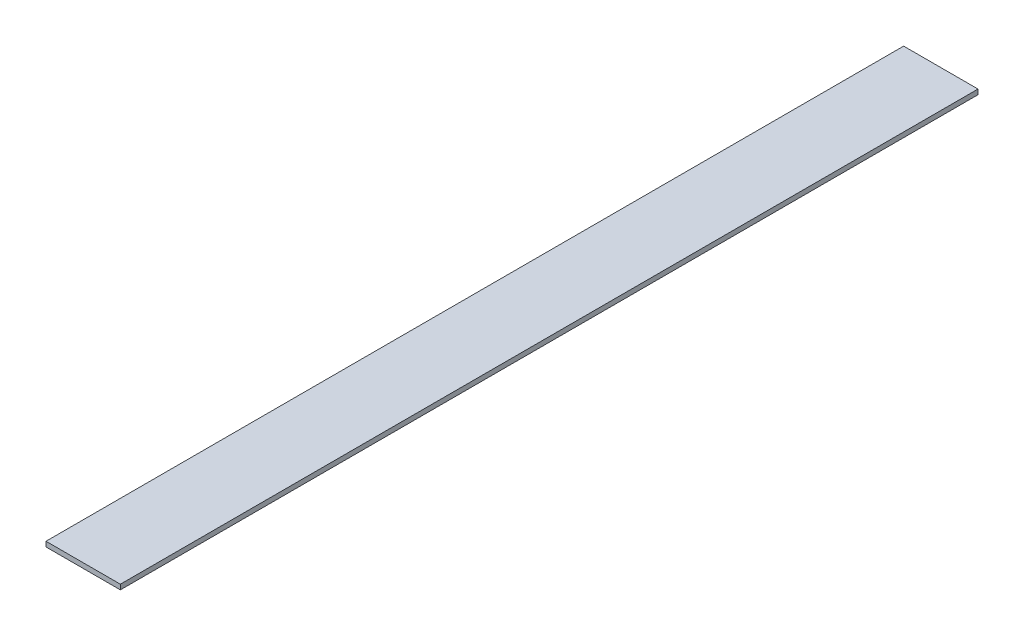
ISO-10303-21;
HEADER;
FILE_DESCRIPTION(('STEP AP214'),'2;1');
FILE_NAME('part.step','',(''),(''),'','','');
FILE_SCHEMA(('AUTOMOTIVE_DESIGN { 1 0 10303 214 1 1 1 1 }'));
ENDSEC;
DATA;
#1=APPLICATION_CONTEXT('core data for automotive mechanical design processes');
#2=APPLICATION_PROTOCOL_DEFINITION('international standard','automotive_design',2000,#1);
#3=PRODUCT_CONTEXT('',#1,'mechanical');
#4=PRODUCT('Part','Part','',(#3));
#5=PRODUCT_RELATED_PRODUCT_CATEGORY('part','',(#4));
#6=PRODUCT_DEFINITION_FORMATION('','',#4);
#7=PRODUCT_DEFINITION_CONTEXT('part definition',#1,'design');
#8=PRODUCT_DEFINITION('design','',#6,#7);
#9=PRODUCT_DEFINITION_SHAPE('','',#8);
#10=(LENGTH_UNIT() NAMED_UNIT(*) SI_UNIT(.MILLI.,.METRE.));
#11=(NAMED_UNIT(*) PLANE_ANGLE_UNIT() SI_UNIT($,.RADIAN.));
#12=(NAMED_UNIT(*) SI_UNIT($,.STERADIAN.) SOLID_ANGLE_UNIT());
#13=UNCERTAINTY_MEASURE_WITH_UNIT(LENGTH_MEASURE(1.E-05),#10,'distance_accuracy_value','');
#14=(GEOMETRIC_REPRESENTATION_CONTEXT(3) GLOBAL_UNCERTAINTY_ASSIGNED_CONTEXT((#13)) GLOBAL_UNIT_ASSIGNED_CONTEXT((#10,
#11,#12)) REPRESENTATION_CONTEXT('',''));
#15=CARTESIAN_POINT('',(0.,0.,0.));
#16=DIRECTION('',(0.,0.,1.));
#17=DIRECTION('',(1.,0.,0.));
#18=AXIS2_PLACEMENT_3D('',#15,#16,#17);
#19=CARTESIAN_POINT('',(15.,-0.999999999999997,-176.066592756746));
#20=DIRECTION('',(0.,-1.,0.));
#21=DIRECTION('',(1.,0.,0.));
#22=AXIS2_PLACEMENT_3D('',#19,#20,#21);
#23=PLANE('',#22);
#24=DIRECTION('',(0.,0.,1.));
#25=VECTOR('',#24,1.);
#26=CARTESIAN_POINT('',(-15.,-1.,-176.066592756746));
#27=LINE('',#26,#25);
#28=CARTESIAN_POINT('',(-15.,-1.,-146.));
#29=VERTEX_POINT('',#28);
#30=CARTESIAN_POINT('',(-15.,-1.,200.));
#31=VERTEX_POINT('',#30);
#32=EDGE_CURVE('E74',#29,#31,#27,.T.);
#33=ORIENTED_EDGE('',*,*,#32,.F.);
#34=DIRECTION('',(1.,0.,0.));
#35=VECTOR('',#34,1.);
#36=CARTESIAN_POINT('',(15.,-0.999999999999997,-146.));
#37=LINE('',#36,#35);
#38=CARTESIAN_POINT('',(15.,-0.999999999999997,-146.));
#39=VERTEX_POINT('',#38);
#40=EDGE_CURVE('E55',#29,#39,#37,.T.);
#41=ORIENTED_EDGE('',*,*,#40,.T.);
#42=DIRECTION('',(0.,0.,1.));
#43=VECTOR('',#42,1.);
#44=CARTESIAN_POINT('',(15.,-0.999999999999997,-176.066592756746));
#45=LINE('',#44,#43);
#46=CARTESIAN_POINT('',(15.,-0.999999999999997,200.));
#47=VERTEX_POINT('',#46);
#48=EDGE_CURVE('E79',#39,#47,#45,.T.);
#49=ORIENTED_EDGE('',*,*,#48,.T.);
#50=DIRECTION('',(1.,0.,0.));
#51=VECTOR('',#50,1.);
#52=CARTESIAN_POINT('',(15.,-0.999999999999997,200.));
#53=LINE('',#52,#51);
#54=EDGE_CURVE('E83',#31,#47,#53,.T.);
#55=ORIENTED_EDGE('',*,*,#54,.F.);
#56=EDGE_LOOP('',(#33,#41,#49,#55));
#57=FACE_BOUND('',#56,.T.);
#58=ADVANCED_FACE('F36',(#57),#23,.T.);
#59=CARTESIAN_POINT('',(15.,-0.999999999999997,-176.066592756746));
#60=DIRECTION('',(1.,0.,0.));
#61=DIRECTION('',(0.,0.,-1.));
#62=AXIS2_PLACEMENT_3D('',#59,#60,#61);
#63=PLANE('',#62);
#64=ORIENTED_EDGE('',*,*,#48,.F.);
#65=DIRECTION('',(0.,1.,0.));
#66=VECTOR('',#65,1.);
#67=CARTESIAN_POINT('',(15.,-1.,-146.));
#68=LINE('',#67,#66);
#69=CARTESIAN_POINT('',(14.9999999999999,1.00000000000002,-146.));
#70=VERTEX_POINT('',#69);
#71=EDGE_CURVE('E97',#39,#70,#68,.T.);
#72=ORIENTED_EDGE('',*,*,#71,.T.);
#73=DIRECTION('',(0.,0.,1.));
#74=VECTOR('',#73,1.);
#75=CARTESIAN_POINT('',(15.,1.,-176.066592756746));
#76=LINE('',#75,#74);
#77=CARTESIAN_POINT('',(15.,1.,200.));
#78=VERTEX_POINT('',#77);
#79=EDGE_CURVE('E102',#70,#78,#76,.T.);
#80=ORIENTED_EDGE('',*,*,#79,.T.);
#81=DIRECTION('',(0.,1.,0.));
#82=VECTOR('',#81,1.);
#83=CARTESIAN_POINT('',(15.,-0.999999999999997,200.));
#84=LINE('',#83,#82);
#85=EDGE_CURVE('E88',#47,#78,#84,.T.);
#86=ORIENTED_EDGE('',*,*,#85,.F.);
#87=EDGE_LOOP('',(#64,#72,#80,#86));
#88=FACE_BOUND('',#87,.T.);
#89=ADVANCED_FACE('F106',(#88),#63,.T.);
#90=CARTESIAN_POINT('',(15.,1.,-176.066592756746));
#91=DIRECTION('',(0.,1.,0.));
#92=DIRECTION('',(-1.,0.,0.));
#93=AXIS2_PLACEMENT_3D('',#90,#91,#92);
#94=PLANE('',#93);
#95=ORIENTED_EDGE('',*,*,#79,.F.);
#96=DIRECTION('',(-1.,0.,0.));
#97=VECTOR('',#96,1.);
#98=CARTESIAN_POINT('',(15.,1.,-146.));
#99=LINE('',#98,#97);
#100=CARTESIAN_POINT('',(-15.0000000000001,1.00000000000002,-146.));
#101=VERTEX_POINT('',#100);
#102=EDGE_CURVE('E40',#70,#101,#99,.T.);
#103=ORIENTED_EDGE('',*,*,#102,.T.);
#104=DIRECTION('',(0.,0.,1.));
#105=VECTOR('',#104,1.);
#106=CARTESIAN_POINT('',(-15.,0.999999999999999,-176.066592756746));
#107=LINE('',#106,#105);
#108=CARTESIAN_POINT('',(-15.,0.999999999999999,200.));
#109=VERTEX_POINT('',#108);
#110=EDGE_CURVE('E100',#101,#109,#107,.T.);
#111=ORIENTED_EDGE('',*,*,#110,.T.);
#112=DIRECTION('',(-1.,0.,0.));
#113=VECTOR('',#112,1.);
#114=CARTESIAN_POINT('',(15.,1.,200.));
#115=LINE('',#114,#113);
#116=EDGE_CURVE('E80',#78,#109,#115,.T.);
#117=ORIENTED_EDGE('',*,*,#116,.F.);
#118=EDGE_LOOP('',(#95,#103,#111,#117));
#119=FACE_BOUND('',#118,.T.);
#120=ADVANCED_FACE('F109',(#119),#94,.T.);
#121=CARTESIAN_POINT('',(-15.,-1.,-176.066592756746));
#122=DIRECTION('',(-1.,0.,0.));
#123=DIRECTION('',(0.,0.,1.));
#124=AXIS2_PLACEMENT_3D('',#121,#122,#123);
#125=PLANE('',#124);
#126=ORIENTED_EDGE('',*,*,#110,.F.);
#127=DIRECTION('',(0.,-1.,0.));
#128=VECTOR('',#127,1.);
#129=CARTESIAN_POINT('',(-15.,-1.,-146.));
#130=LINE('',#129,#128);
#131=EDGE_CURVE('E11',#101,#29,#130,.T.);
#132=ORIENTED_EDGE('',*,*,#131,.T.);
#133=ORIENTED_EDGE('',*,*,#32,.T.);
#134=DIRECTION('',(0.,-1.,0.));
#135=VECTOR('',#134,1.);
#136=CARTESIAN_POINT('',(-15.,-1.,200.));
#137=LINE('',#136,#135);
#138=EDGE_CURVE('E77',#109,#31,#137,.T.);
#139=ORIENTED_EDGE('',*,*,#138,.F.);
#140=EDGE_LOOP('',(#126,#132,#133,#139));
#141=FACE_BOUND('',#140,.T.);
#142=ADVANCED_FACE('F38',(#141),#125,.T.);
#143=CARTESIAN_POINT('',(248.152298935701,-6.99999999999995,-146.));
#144=DIRECTION('',(0.,0.,-1.));
#145=DIRECTION('',(0.,1.,0.));
#146=AXIS2_PLACEMENT_3D('',#143,#144,#145);
#147=PLANE('',#146);
#148=ORIENTED_EDGE('',*,*,#102,.F.);
#149=ORIENTED_EDGE('',*,*,#71,.F.);
#150=ORIENTED_EDGE('',*,*,#40,.F.);
#151=ORIENTED_EDGE('',*,*,#131,.F.);
#152=EDGE_LOOP('',(#148,#149,#150,#151));
#153=FACE_BOUND('',#152,.T.);
#154=ADVANCED_FACE('F110',(#153),#147,.T.);
#155=CARTESIAN_POINT('',(0.,0.,200.));
#156=DIRECTION('',(0.,0.,1.));
#157=DIRECTION('',(1.,0.,0.));
#158=AXIS2_PLACEMENT_3D('',#155,#156,#157);
#159=PLANE('',#158);
#160=ORIENTED_EDGE('',*,*,#138,.T.);
#161=ORIENTED_EDGE('',*,*,#54,.T.);
#162=ORIENTED_EDGE('',*,*,#85,.T.);
#163=ORIENTED_EDGE('',*,*,#116,.T.);
#164=EDGE_LOOP('',(#160,#161,#162,#163));
#165=FACE_BOUND('',#164,.T.);
#166=ADVANCED_FACE('F91',(#165),#159,.T.);
#167=CLOSED_SHELL('',(#58,#89,#120,#142,#154,#166));
#168=MANIFOLD_SOLID_BREP('B2',#167);
#169=ADVANCED_BREP_SHAPE_REPRESENTATION('',(#18,#168),#14);
#170=SHAPE_DEFINITION_REPRESENTATION(#9,#169);
ENDSEC;
END-ISO-10303-21;
